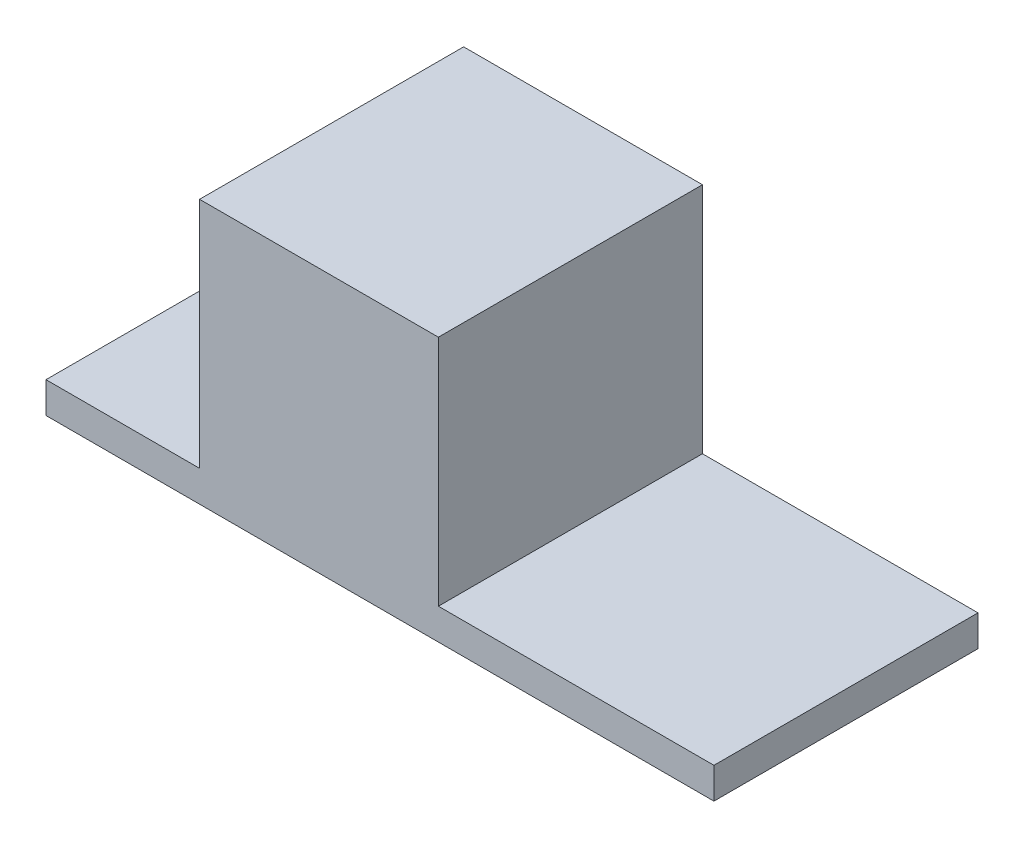
ISO-10303-21;
HEADER;
FILE_DESCRIPTION(('STEP AP214'),'2;1');
FILE_NAME('part.step','',(''),(''),'','','');
FILE_SCHEMA(('AUTOMOTIVE_DESIGN { 1 0 10303 214 1 1 1 1 }'));
ENDSEC;
DATA;
#1=APPLICATION_CONTEXT('core data for automotive mechanical design processes');
#2=APPLICATION_PROTOCOL_DEFINITION('international standard','automotive_design',2000,#1);
#3=PRODUCT_CONTEXT('',#1,'mechanical');
#4=PRODUCT('Part','Part','',(#3));
#5=PRODUCT_RELATED_PRODUCT_CATEGORY('part','',(#4));
#6=PRODUCT_DEFINITION_FORMATION('','',#4);
#7=PRODUCT_DEFINITION_CONTEXT('part definition',#1,'design');
#8=PRODUCT_DEFINITION('design','',#6,#7);
#9=PRODUCT_DEFINITION_SHAPE('','',#8);
#10=(LENGTH_UNIT() NAMED_UNIT(*) SI_UNIT(.MILLI.,.METRE.));
#11=(NAMED_UNIT(*) PLANE_ANGLE_UNIT() SI_UNIT($,.RADIAN.));
#12=(NAMED_UNIT(*) SI_UNIT($,.STERADIAN.) SOLID_ANGLE_UNIT());
#13=UNCERTAINTY_MEASURE_WITH_UNIT(LENGTH_MEASURE(1.E-05),#10,'distance_accuracy_value','');
#14=(GEOMETRIC_REPRESENTATION_CONTEXT(3) GLOBAL_UNCERTAINTY_ASSIGNED_CONTEXT((#13)) GLOBAL_UNIT_ASSIGNED_CONTEXT((#10,
#11,#12)) REPRESENTATION_CONTEXT('',''));
#15=CARTESIAN_POINT('',(0.,0.,0.));
#16=DIRECTION('',(0.,0.,1.));
#17=DIRECTION('',(1.,0.,0.));
#18=AXIS2_PLACEMENT_3D('',#15,#16,#17);
#19=CARTESIAN_POINT('',(0.,2.,0.));
#20=DIRECTION('',(0.,1.,0.));
#21=DIRECTION('',(0.,0.,1.));
#22=AXIS2_PLACEMENT_3D('',#19,#20,#21);
#23=PLANE('',#22);
#24=DIRECTION('',(0.,0.,1.));
#25=VECTOR('',#24,1.);
#26=CARTESIAN_POINT('',(9.88710644871868,2.,0.));
#27=LINE('',#26,#25);
#28=CARTESIAN_POINT('',(9.88710644871868,2.,0.));
#29=VERTEX_POINT('',#28);
#30=CARTESIAN_POINT('',(9.88710644871868,2.,17.));
#31=VERTEX_POINT('',#30);
#32=EDGE_CURVE('E48',#29,#31,#27,.T.);
#33=ORIENTED_EDGE('',*,*,#32,.F.);
#34=DIRECTION('',(-1.,0.,0.));
#35=VECTOR('',#34,1.);
#36=CARTESIAN_POINT('',(0.,2.,0.));
#37=LINE('',#36,#35);
#38=CARTESIAN_POINT('',(0.,2.,0.));
#39=VERTEX_POINT('',#38);
#40=EDGE_CURVE('E137',#29,#39,#37,.T.);
#41=ORIENTED_EDGE('',*,*,#40,.T.);
#42=DIRECTION('',(0.,0.,1.));
#43=VECTOR('',#42,1.);
#44=CARTESIAN_POINT('',(0.,2.,0.));
#45=LINE('',#44,#43);
#46=CARTESIAN_POINT('',(0.,2.,17.));
#47=VERTEX_POINT('',#46);
#48=EDGE_CURVE('E128',#39,#47,#45,.T.);
#49=ORIENTED_EDGE('',*,*,#48,.T.);
#50=DIRECTION('',(1.,0.,0.));
#51=VECTOR('',#50,1.);
#52=CARTESIAN_POINT('',(0.,2.,17.));
#53=LINE('',#52,#51);
#54=EDGE_CURVE('E133',#47,#31,#53,.T.);
#55=ORIENTED_EDGE('',*,*,#54,.T.);
#56=EDGE_LOOP('',(#33,#41,#49,#55));
#57=FACE_BOUND('',#56,.T.);
#58=ADVANCED_FACE('F33',(#57),#23,.T.);
#59=CARTESIAN_POINT('',(0.,2.,0.));
#60=DIRECTION('',(1.,0.,0.));
#61=DIRECTION('',(0.,0.,-1.));
#62=AXIS2_PLACEMENT_3D('',#59,#60,#61);
#63=PLANE('',#62);
#64=DIRECTION('',(0.,0.,1.));
#65=VECTOR('',#64,1.);
#66=CARTESIAN_POINT('',(0.,0.,0.));
#67=LINE('',#66,#65);
#68=CARTESIAN_POINT('',(0.,0.,0.));
#69=VERTEX_POINT('',#68);
#70=CARTESIAN_POINT('',(0.,0.,17.));
#71=VERTEX_POINT('',#70);
#72=EDGE_CURVE('E119',#69,#71,#67,.T.);
#73=ORIENTED_EDGE('',*,*,#72,.T.);
#74=DIRECTION('',(0.,-1.,0.));
#75=VECTOR('',#74,1.);
#76=CARTESIAN_POINT('',(0.,2.,17.));
#77=LINE('',#76,#75);
#78=EDGE_CURVE('E11',#47,#71,#77,.T.);
#79=ORIENTED_EDGE('',*,*,#78,.F.);
#80=ORIENTED_EDGE('',*,*,#48,.F.);
#81=DIRECTION('',(0.,-1.,0.));
#82=VECTOR('',#81,1.);
#83=CARTESIAN_POINT('',(0.,2.,0.));
#84=LINE('',#83,#82);
#85=EDGE_CURVE('E139',#39,#69,#84,.T.);
#86=ORIENTED_EDGE('',*,*,#85,.T.);
#87=EDGE_LOOP('',(#73,#79,#80,#86));
#88=FACE_BOUND('',#87,.T.);
#89=ADVANCED_FACE('F35',(#88),#63,.F.);
#90=CARTESIAN_POINT('',(0.,2.,17.));
#91=DIRECTION('',(0.,0.,-1.));
#92=DIRECTION('',(-1.,0.,0.));
#93=AXIS2_PLACEMENT_3D('',#90,#91,#92);
#94=PLANE('',#93);
#95=DIRECTION('',(1.,0.,0.));
#96=VECTOR('',#95,1.);
#97=CARTESIAN_POINT('',(0.,0.,17.));
#98=LINE('',#97,#96);
#99=CARTESIAN_POINT('',(43.,0.,17.));
#100=VERTEX_POINT('',#99);
#101=EDGE_CURVE('E122',#71,#100,#98,.T.);
#102=ORIENTED_EDGE('',*,*,#101,.T.);
#103=DIRECTION('',(0.,-1.,0.));
#104=VECTOR('',#103,1.);
#105=CARTESIAN_POINT('',(43.,2.,17.));
#106=LINE('',#105,#104);
#107=CARTESIAN_POINT('',(43.,2.,17.));
#108=VERTEX_POINT('',#107);
#109=EDGE_CURVE('E41',#108,#100,#106,.T.);
#110=ORIENTED_EDGE('',*,*,#109,.F.);
#111=CARTESIAN_POINT('',(25.2615027955307,2.,17.));
#112=VERTEX_POINT('',#111);
#113=EDGE_CURVE('E131',#112,#108,#53,.T.);
#114=ORIENTED_EDGE('',*,*,#113,.F.);
#115=DIRECTION('',(0.,-1.,0.));
#116=VECTOR('',#115,1.);
#117=CARTESIAN_POINT('',(25.2615027955307,17.,17.));
#118=LINE('',#117,#116);
#119=CARTESIAN_POINT('',(25.2615027955307,17.,17.));
#120=VERTEX_POINT('',#119);
#121=EDGE_CURVE('E104',#120,#112,#118,.T.);
#122=ORIENTED_EDGE('',*,*,#121,.F.);
#123=DIRECTION('',(1.,0.,0.));
#124=VECTOR('',#123,1.);
#125=CARTESIAN_POINT('',(9.88710644871868,17.,17.));
#126=LINE('',#125,#124);
#127=CARTESIAN_POINT('',(9.88710644871868,17.,17.));
#128=VERTEX_POINT('',#127);
#129=EDGE_CURVE('E98',#128,#120,#126,.T.);
#130=ORIENTED_EDGE('',*,*,#129,.F.);
#131=DIRECTION('',(0.,-1.,0.));
#132=VECTOR('',#131,1.);
#133=CARTESIAN_POINT('',(9.88710644871868,17.,17.));
#134=LINE('',#133,#132);
#135=EDGE_CURVE('E102',#128,#31,#134,.T.);
#136=ORIENTED_EDGE('',*,*,#135,.T.);
#137=ORIENTED_EDGE('',*,*,#54,.F.);
#138=ORIENTED_EDGE('',*,*,#78,.T.);
#139=EDGE_LOOP('',(#102,#110,#114,#122,#130,#136,#137,#138));
#140=FACE_BOUND('',#139,.T.);
#141=ADVANCED_FACE('F100',(#140),#94,.F.);
#142=CARTESIAN_POINT('',(43.,2.,0.));
#143=DIRECTION('',(-1.,0.,0.));
#144=DIRECTION('',(0.,0.,1.));
#145=AXIS2_PLACEMENT_3D('',#142,#143,#144);
#146=PLANE('',#145);
#147=DIRECTION('',(0.,0.,-1.));
#148=VECTOR('',#147,1.);
#149=CARTESIAN_POINT('',(43.,0.,0.));
#150=LINE('',#149,#148);
#151=CARTESIAN_POINT('',(43.,0.,0.));
#152=VERTEX_POINT('',#151);
#153=EDGE_CURVE('E142',#100,#152,#150,.T.);
#154=ORIENTED_EDGE('',*,*,#153,.T.);
#155=DIRECTION('',(0.,-1.,0.));
#156=VECTOR('',#155,1.);
#157=CARTESIAN_POINT('',(43.,2.,0.));
#158=LINE('',#157,#156);
#159=CARTESIAN_POINT('',(43.,2.,0.));
#160=VERTEX_POINT('',#159);
#161=EDGE_CURVE('E147',#160,#152,#158,.T.);
#162=ORIENTED_EDGE('',*,*,#161,.F.);
#163=DIRECTION('',(0.,0.,-1.));
#164=VECTOR('',#163,1.);
#165=CARTESIAN_POINT('',(43.,2.,0.));
#166=LINE('',#165,#164);
#167=EDGE_CURVE('E135',#108,#160,#166,.T.);
#168=ORIENTED_EDGE('',*,*,#167,.F.);
#169=ORIENTED_EDGE('',*,*,#109,.T.);
#170=EDGE_LOOP('',(#154,#162,#168,#169));
#171=FACE_BOUND('',#170,.T.);
#172=ADVANCED_FACE('F154',(#171),#146,.F.);
#173=CARTESIAN_POINT('',(0.,2.,0.));
#174=DIRECTION('',(0.,0.,1.));
#175=DIRECTION('',(1.,0.,0.));
#176=AXIS2_PLACEMENT_3D('',#173,#174,#175);
#177=PLANE('',#176);
#178=DIRECTION('',(-1.,0.,0.));
#179=VECTOR('',#178,1.);
#180=CARTESIAN_POINT('',(0.,0.,0.));
#181=LINE('',#180,#179);
#182=EDGE_CURVE('E132',#152,#69,#181,.T.);
#183=ORIENTED_EDGE('',*,*,#182,.T.);
#184=ORIENTED_EDGE('',*,*,#85,.F.);
#185=ORIENTED_EDGE('',*,*,#40,.F.);
#186=DIRECTION('',(0.,-1.,0.));
#187=VECTOR('',#186,1.);
#188=CARTESIAN_POINT('',(9.88710644871868,17.,0.));
#189=LINE('',#188,#187);
#190=CARTESIAN_POINT('',(9.88710644871868,17.,0.));
#191=VERTEX_POINT('',#190);
#192=EDGE_CURVE('E167',#191,#29,#189,.T.);
#193=ORIENTED_EDGE('',*,*,#192,.F.);
#194=DIRECTION('',(-1.,0.,0.));
#195=VECTOR('',#194,1.);
#196=CARTESIAN_POINT('',(9.88710644871868,17.,0.));
#197=LINE('',#196,#195);
#198=CARTESIAN_POINT('',(25.2615027955307,17.,0.));
#199=VERTEX_POINT('',#198);
#200=EDGE_CURVE('E113',#199,#191,#197,.T.);
#201=ORIENTED_EDGE('',*,*,#200,.F.);
#202=DIRECTION('',(0.,-1.,0.));
#203=VECTOR('',#202,1.);
#204=CARTESIAN_POINT('',(25.2615027955307,17.,0.));
#205=LINE('',#204,#203);
#206=CARTESIAN_POINT('',(25.2615027955307,2.,0.));
#207=VERTEX_POINT('',#206);
#208=EDGE_CURVE('E124',#199,#207,#205,.T.);
#209=ORIENTED_EDGE('',*,*,#208,.T.);
#210=EDGE_CURVE('E138',#160,#207,#37,.T.);
#211=ORIENTED_EDGE('',*,*,#210,.F.);
#212=ORIENTED_EDGE('',*,*,#161,.T.);
#213=EDGE_LOOP('',(#183,#184,#185,#193,#201,#209,#211,#212));
#214=FACE_BOUND('',#213,.T.);
#215=ADVANCED_FACE('F162',(#214),#177,.F.);
#216=DIRECTION('',(0.,0.,-1.));
#217=VECTOR('',#216,1.);
#218=CARTESIAN_POINT('',(25.2615027955307,2.,0.));
#219=LINE('',#218,#217);
#220=EDGE_CURVE('E56',#112,#207,#219,.T.);
#221=ORIENTED_EDGE('',*,*,#220,.F.);
#222=ORIENTED_EDGE('',*,*,#113,.T.);
#223=ORIENTED_EDGE('',*,*,#167,.T.);
#224=ORIENTED_EDGE('',*,*,#210,.T.);
#225=EDGE_LOOP('',(#221,#222,#223,#224));
#226=FACE_BOUND('',#225,.T.);
#227=ADVANCED_FACE('F177',(#226),#23,.T.);
#228=CARTESIAN_POINT('',(0.,0.,0.));
#229=DIRECTION('',(0.,1.,0.));
#230=DIRECTION('',(0.,0.,1.));
#231=AXIS2_PLACEMENT_3D('',#228,#229,#230);
#232=PLANE('',#231);
#233=ORIENTED_EDGE('',*,*,#72,.F.);
#234=ORIENTED_EDGE('',*,*,#182,.F.);
#235=ORIENTED_EDGE('',*,*,#153,.F.);
#236=ORIENTED_EDGE('',*,*,#101,.F.);
#237=EDGE_LOOP('',(#233,#234,#235,#236));
#238=FACE_BOUND('',#237,.T.);
#239=ADVANCED_FACE('F159',(#238),#232,.F.);
#240=CARTESIAN_POINT('',(9.88710644871868,17.,0.));
#241=DIRECTION('',(1.,0.,0.));
#242=DIRECTION('',(0.,0.,-1.));
#243=AXIS2_PLACEMENT_3D('',#240,#241,#242);
#244=PLANE('',#243);
#245=ORIENTED_EDGE('',*,*,#32,.T.);
#246=ORIENTED_EDGE('',*,*,#135,.F.);
#247=DIRECTION('',(0.,0.,1.));
#248=VECTOR('',#247,1.);
#249=CARTESIAN_POINT('',(9.88710644871868,17.,0.));
#250=LINE('',#249,#248);
#251=EDGE_CURVE('E108',#191,#128,#250,.T.);
#252=ORIENTED_EDGE('',*,*,#251,.F.);
#253=ORIENTED_EDGE('',*,*,#192,.T.);
#254=EDGE_LOOP('',(#245,#246,#252,#253));
#255=FACE_BOUND('',#254,.T.);
#256=ADVANCED_FACE('F118',(#255),#244,.F.);
#257=CARTESIAN_POINT('',(25.2615027955307,17.,0.));
#258=DIRECTION('',(-1.,0.,0.));
#259=DIRECTION('',(0.,0.,1.));
#260=AXIS2_PLACEMENT_3D('',#257,#258,#259);
#261=PLANE('',#260);
#262=ORIENTED_EDGE('',*,*,#220,.T.);
#263=ORIENTED_EDGE('',*,*,#208,.F.);
#264=DIRECTION('',(0.,0.,-1.));
#265=VECTOR('',#264,1.);
#266=CARTESIAN_POINT('',(25.2615027955307,17.,0.));
#267=LINE('',#266,#265);
#268=EDGE_CURVE('E107',#120,#199,#267,.T.);
#269=ORIENTED_EDGE('',*,*,#268,.F.);
#270=ORIENTED_EDGE('',*,*,#121,.T.);
#271=EDGE_LOOP('',(#262,#263,#269,#270));
#272=FACE_BOUND('',#271,.T.);
#273=ADVANCED_FACE('F176',(#272),#261,.F.);
#274=CARTESIAN_POINT('',(0.,17.,0.));
#275=DIRECTION('',(0.,1.,0.));
#276=DIRECTION('',(0.,0.,1.));
#277=AXIS2_PLACEMENT_3D('',#274,#275,#276);
#278=PLANE('',#277);
#279=ORIENTED_EDGE('',*,*,#251,.T.);
#280=ORIENTED_EDGE('',*,*,#129,.T.);
#281=ORIENTED_EDGE('',*,*,#268,.T.);
#282=ORIENTED_EDGE('',*,*,#200,.T.);
#283=EDGE_LOOP('',(#279,#280,#281,#282));
#284=FACE_BOUND('',#283,.T.);
#285=ADVANCED_FACE('F111',(#284),#278,.T.);
#286=CLOSED_SHELL('',(#58,#89,#141,#172,#215,#227,#239,#256,#273,#285));
#287=MANIFOLD_SOLID_BREP('B2',#286);
#288=ADVANCED_BREP_SHAPE_REPRESENTATION('',(#18,#287),#14);
#289=SHAPE_DEFINITION_REPRESENTATION(#9,#288);
ENDSEC;
END-ISO-10303-21;
